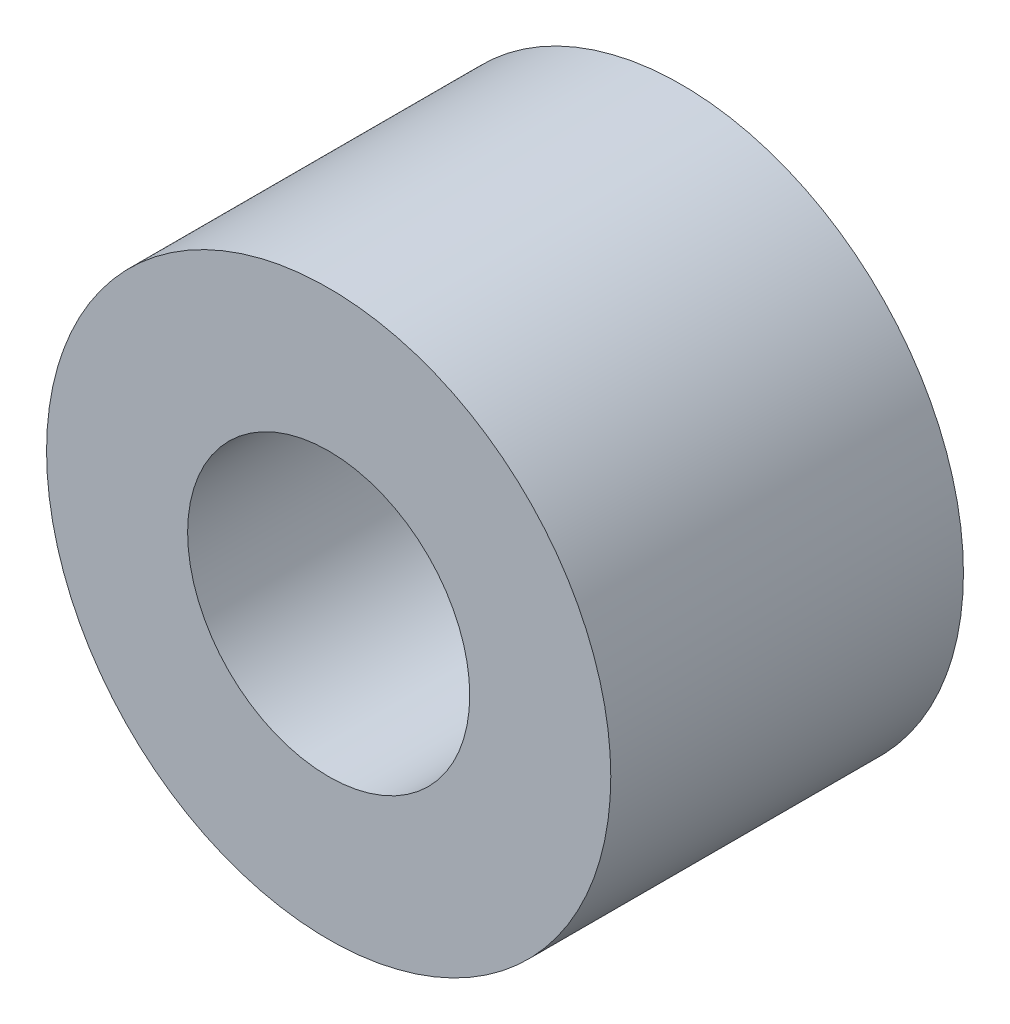
ISO-10303-21;
HEADER;
FILE_DESCRIPTION(('STEP AP214'),'2;1');
FILE_NAME('part.step','',(''),(''),'','','');
FILE_SCHEMA(('AUTOMOTIVE_DESIGN { 1 0 10303 214 1 1 1 1 }'));
ENDSEC;
DATA;
#1=APPLICATION_CONTEXT('core data for automotive mechanical design processes');
#2=APPLICATION_PROTOCOL_DEFINITION('international standard','automotive_design',2000,#1);
#3=PRODUCT_CONTEXT('',#1,'mechanical');
#4=PRODUCT('Part','Part','',(#3));
#5=PRODUCT_RELATED_PRODUCT_CATEGORY('part','',(#4));
#6=PRODUCT_DEFINITION_FORMATION('','',#4);
#7=PRODUCT_DEFINITION_CONTEXT('part definition',#1,'design');
#8=PRODUCT_DEFINITION('design','',#6,#7);
#9=PRODUCT_DEFINITION_SHAPE('','',#8);
#10=(LENGTH_UNIT() NAMED_UNIT(*) SI_UNIT(.MILLI.,.METRE.));
#11=(NAMED_UNIT(*) PLANE_ANGLE_UNIT() SI_UNIT($,.RADIAN.));
#12=(NAMED_UNIT(*) SI_UNIT($,.STERADIAN.) SOLID_ANGLE_UNIT());
#13=UNCERTAINTY_MEASURE_WITH_UNIT(LENGTH_MEASURE(1.E-05),#10,'distance_accuracy_value','');
#14=(GEOMETRIC_REPRESENTATION_CONTEXT(3) GLOBAL_UNCERTAINTY_ASSIGNED_CONTEXT((#13)) GLOBAL_UNIT_ASSIGNED_CONTEXT((#10,
#11,#12)) REPRESENTATION_CONTEXT('',''));
#15=CARTESIAN_POINT('',(0.,0.,0.));
#16=DIRECTION('',(0.,0.,1.));
#17=DIRECTION('',(1.,0.,0.));
#18=AXIS2_PLACEMENT_3D('',#15,#16,#17);
#19=CARTESIAN_POINT('',(0.,0.,2.5));
#20=DIRECTION('',(0.,0.,1.));
#21=DIRECTION('',(1.,0.,0.));
#22=AXIS2_PLACEMENT_3D('',#19,#20,#21);
#23=PLANE('',#22);
#24=CARTESIAN_POINT('',(0.,0.,2.5));
#25=DIRECTION('',(0.,0.,1.));
#26=DIRECTION('',(1.,0.,0.));
#27=AXIS2_PLACEMENT_3D('',#24,#25,#26);
#28=CIRCLE('',#27,2.);
#29=CARTESIAN_POINT('',(2.,0.,2.5));
#30=VERTEX_POINT('',#29);
#31=EDGE_CURVE('E10',#30,#30,#28,.T.);
#32=ORIENTED_EDGE('',*,*,#31,.T.);
#33=EDGE_LOOP('',(#32));
#34=FACE_BOUND('',#33,.T.);
#35=CARTESIAN_POINT('',(0.,0.,2.5));
#36=DIRECTION('',(0.,0.,1.));
#37=DIRECTION('',(1.,0.,0.));
#38=AXIS2_PLACEMENT_3D('',#35,#36,#37);
#39=CIRCLE('',#38,1.);
#40=CARTESIAN_POINT('',(1.,0.,2.5));
#41=VERTEX_POINT('',#40);
#42=EDGE_CURVE('E48',#41,#41,#39,.T.);
#43=ORIENTED_EDGE('',*,*,#42,.F.);
#44=EDGE_LOOP('',(#43));
#45=FACE_BOUND('',#44,.T.);
#46=ADVANCED_FACE('F37',(#34,#45),#23,.T.);
#47=CARTESIAN_POINT('',(0.,0.,0.));
#48=DIRECTION('',(0.,0.,1.));
#49=DIRECTION('',(1.,0.,0.));
#50=AXIS2_PLACEMENT_3D('',#47,#48,#49);
#51=PLANE('',#50);
#52=CARTESIAN_POINT('',(0.,0.,0.));
#53=DIRECTION('',(0.,0.,1.));
#54=DIRECTION('',(1.,0.,0.));
#55=AXIS2_PLACEMENT_3D('',#52,#53,#54);
#56=CIRCLE('',#55,2.);
#57=CARTESIAN_POINT('',(2.,0.,0.));
#58=VERTEX_POINT('',#57);
#59=EDGE_CURVE('E41',#58,#58,#56,.T.);
#60=ORIENTED_EDGE('',*,*,#59,.F.);
#61=EDGE_LOOP('',(#60));
#62=FACE_BOUND('',#61,.T.);
#63=CARTESIAN_POINT('',(0.,0.,0.));
#64=DIRECTION('',(0.,0.,1.));
#65=DIRECTION('',(1.,0.,0.));
#66=AXIS2_PLACEMENT_3D('',#63,#64,#65);
#67=CIRCLE('',#66,1.);
#68=CARTESIAN_POINT('',(1.,0.,0.));
#69=VERTEX_POINT('',#68);
#70=EDGE_CURVE('E50',#69,#69,#67,.T.);
#71=ORIENTED_EDGE('',*,*,#70,.T.);
#72=EDGE_LOOP('',(#71));
#73=FACE_BOUND('',#72,.T.);
#74=ADVANCED_FACE('F60',(#62,#73),#51,.F.);
#75=CARTESIAN_POINT('',(0.,0.,2.5));
#76=DIRECTION('',(0.,0.,-1.));
#77=DIRECTION('',(-1.,0.,0.));
#78=AXIS2_PLACEMENT_3D('',#75,#76,#77);
#79=CYLINDRICAL_SURFACE('',#78,2.);
#80=ORIENTED_EDGE('',*,*,#31,.F.);
#81=EDGE_LOOP('',(#80));
#82=FACE_BOUND('',#81,.T.);
#83=ORIENTED_EDGE('',*,*,#59,.T.);
#84=EDGE_LOOP('',(#83));
#85=FACE_BOUND('',#84,.T.);
#86=ADVANCED_FACE('F39',(#82,#85),#79,.T.);
#87=CARTESIAN_POINT('',(0.,0.,2.5));
#88=DIRECTION('',(0.,0.,-1.));
#89=DIRECTION('',(-1.,0.,0.));
#90=AXIS2_PLACEMENT_3D('',#87,#88,#89);
#91=CYLINDRICAL_SURFACE('',#90,1.);
#92=ORIENTED_EDGE('',*,*,#42,.T.);
#93=EDGE_LOOP('',(#92));
#94=FACE_BOUND('',#93,.T.);
#95=ORIENTED_EDGE('',*,*,#70,.F.);
#96=EDGE_LOOP('',(#95));
#97=FACE_BOUND('',#96,.T.);
#98=ADVANCED_FACE('F56',(#94,#97),#91,.F.);
#99=CLOSED_SHELL('',(#46,#74,#86,#98));
#100=MANIFOLD_SOLID_BREP('B2',#99);
#101=ADVANCED_BREP_SHAPE_REPRESENTATION('',(#18,#100),#14);
#102=SHAPE_DEFINITION_REPRESENTATION(#9,#101);
ENDSEC;
END-ISO-10303-21;
